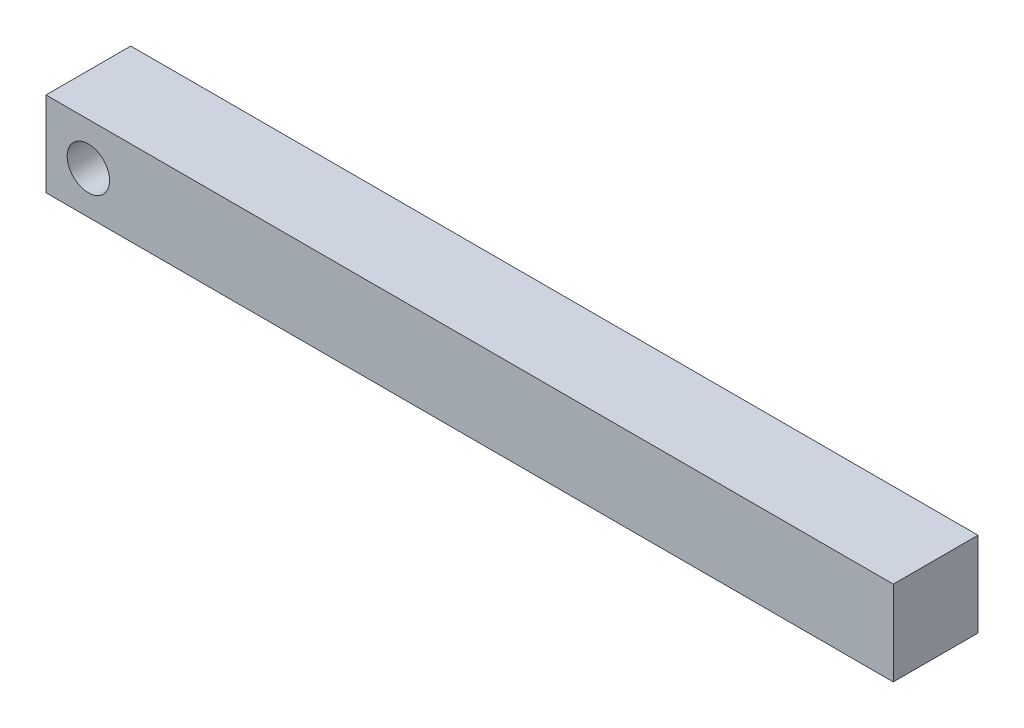
ISO-10303-21;
HEADER;
FILE_DESCRIPTION(('STEP AP214'),'2;1');
FILE_NAME('part.step','',(''),(''),'','','');
FILE_SCHEMA(('AUTOMOTIVE_DESIGN { 1 0 10303 214 1 1 1 1 }'));
ENDSEC;
DATA;
#1=APPLICATION_CONTEXT('core data for automotive mechanical design processes');
#2=APPLICATION_PROTOCOL_DEFINITION('international standard','automotive_design',2000,#1);
#3=PRODUCT_CONTEXT('',#1,'mechanical');
#4=PRODUCT('Part','Part','',(#3));
#5=PRODUCT_RELATED_PRODUCT_CATEGORY('part','',(#4));
#6=PRODUCT_DEFINITION_FORMATION('','',#4);
#7=PRODUCT_DEFINITION_CONTEXT('part definition',#1,'design');
#8=PRODUCT_DEFINITION('design','',#6,#7);
#9=PRODUCT_DEFINITION_SHAPE('','',#8);
#10=(LENGTH_UNIT() NAMED_UNIT(*) SI_UNIT(.MILLI.,.METRE.));
#11=(NAMED_UNIT(*) PLANE_ANGLE_UNIT() SI_UNIT($,.RADIAN.));
#12=(NAMED_UNIT(*) SI_UNIT($,.STERADIAN.) SOLID_ANGLE_UNIT());
#13=UNCERTAINTY_MEASURE_WITH_UNIT(LENGTH_MEASURE(1.E-05),#10,'distance_accuracy_value','');
#14=(GEOMETRIC_REPRESENTATION_CONTEXT(3) GLOBAL_UNCERTAINTY_ASSIGNED_CONTEXT((#13)) GLOBAL_UNIT_ASSIGNED_CONTEXT((#10,
#11,#12)) REPRESENTATION_CONTEXT('',''));
#15=CARTESIAN_POINT('',(0.,0.,0.));
#16=DIRECTION('',(0.,0.,1.));
#17=DIRECTION('',(1.,0.,0.));
#18=AXIS2_PLACEMENT_3D('',#15,#16,#17);
#19=CARTESIAN_POINT('',(100.,10.,20.));
#20=DIRECTION('',(-1.,0.,0.));
#21=DIRECTION('',(0.,-1.,0.));
#22=AXIS2_PLACEMENT_3D('',#19,#20,#21);
#23=PLANE('',#22);
#24=DIRECTION('',(0.,1.,0.));
#25=VECTOR('',#24,1.);
#26=CARTESIAN_POINT('',(100.,10.,0.));
#27=LINE('',#26,#25);
#28=CARTESIAN_POINT('',(100.,-10.,0.));
#29=VERTEX_POINT('',#28);
#30=CARTESIAN_POINT('',(100.,10.,0.));
#31=VERTEX_POINT('',#30);
#32=EDGE_CURVE('E103',#29,#31,#27,.T.);
#33=ORIENTED_EDGE('',*,*,#32,.T.);
#34=DIRECTION('',(0.,0.,-1.));
#35=VECTOR('',#34,1.);
#36=CARTESIAN_POINT('',(100.,10.,20.));
#37=LINE('',#36,#35);
#38=CARTESIAN_POINT('',(100.,10.,20.));
#39=VERTEX_POINT('',#38);
#40=EDGE_CURVE('E11',#39,#31,#37,.T.);
#41=ORIENTED_EDGE('',*,*,#40,.F.);
#42=DIRECTION('',(0.,1.,0.));
#43=VECTOR('',#42,1.);
#44=CARTESIAN_POINT('',(100.,10.,20.));
#45=LINE('',#44,#43);
#46=CARTESIAN_POINT('',(100.,-10.,20.));
#47=VERTEX_POINT('',#46);
#48=EDGE_CURVE('E91',#47,#39,#45,.T.);
#49=ORIENTED_EDGE('',*,*,#48,.F.);
#50=DIRECTION('',(0.,0.,-1.));
#51=VECTOR('',#50,1.);
#52=CARTESIAN_POINT('',(100.,-10.,20.));
#53=LINE('',#52,#51);
#54=EDGE_CURVE('E99',#47,#29,#53,.T.);
#55=ORIENTED_EDGE('',*,*,#54,.T.);
#56=EDGE_LOOP('',(#33,#41,#49,#55));
#57=FACE_BOUND('',#56,.T.);
#58=ADVANCED_FACE('F40',(#57),#23,.F.);
#59=CARTESIAN_POINT('',(-100.,10.,20.));
#60=DIRECTION('',(0.,-1.,0.));
#61=DIRECTION('',(0.,0.,-1.));
#62=AXIS2_PLACEMENT_3D('',#59,#60,#61);
#63=PLANE('',#62);
#64=DIRECTION('',(-1.,0.,0.));
#65=VECTOR('',#64,1.);
#66=CARTESIAN_POINT('',(-100.,10.,0.));
#67=LINE('',#66,#65);
#68=CARTESIAN_POINT('',(-100.,10.,0.));
#69=VERTEX_POINT('',#68);
#70=EDGE_CURVE('E95',#31,#69,#67,.T.);
#71=ORIENTED_EDGE('',*,*,#70,.T.);
#72=DIRECTION('',(0.,0.,-1.));
#73=VECTOR('',#72,1.);
#74=CARTESIAN_POINT('',(-100.,10.,20.));
#75=LINE('',#74,#73);
#76=CARTESIAN_POINT('',(-100.,10.,20.));
#77=VERTEX_POINT('',#76);
#78=EDGE_CURVE('E48',#77,#69,#75,.T.);
#79=ORIENTED_EDGE('',*,*,#78,.F.);
#80=DIRECTION('',(-1.,0.,0.));
#81=VECTOR('',#80,1.);
#82=CARTESIAN_POINT('',(-100.,10.,20.));
#83=LINE('',#82,#81);
#84=EDGE_CURVE('E86',#39,#77,#83,.T.);
#85=ORIENTED_EDGE('',*,*,#84,.F.);
#86=ORIENTED_EDGE('',*,*,#40,.T.);
#87=EDGE_LOOP('',(#71,#79,#85,#86));
#88=FACE_BOUND('',#87,.T.);
#89=ADVANCED_FACE('F94',(#88),#63,.F.);
#90=CARTESIAN_POINT('',(-100.,10.,20.));
#91=DIRECTION('',(1.,0.,0.));
#92=DIRECTION('',(0.,0.,-1.));
#93=AXIS2_PLACEMENT_3D('',#90,#91,#92);
#94=PLANE('',#93);
#95=DIRECTION('',(0.,-1.,0.));
#96=VECTOR('',#95,1.);
#97=CARTESIAN_POINT('',(-100.,10.,0.));
#98=LINE('',#97,#96);
#99=CARTESIAN_POINT('',(-100.,-10.,0.));
#100=VERTEX_POINT('',#99);
#101=EDGE_CURVE('E73',#69,#100,#98,.T.);
#102=ORIENTED_EDGE('',*,*,#101,.T.);
#103=DIRECTION('',(0.,0.,-1.));
#104=VECTOR('',#103,1.);
#105=CARTESIAN_POINT('',(-100.,-10.,20.));
#106=LINE('',#105,#104);
#107=CARTESIAN_POINT('',(-100.,-10.,20.));
#108=VERTEX_POINT('',#107);
#109=EDGE_CURVE('E96',#108,#100,#106,.T.);
#110=ORIENTED_EDGE('',*,*,#109,.F.);
#111=DIRECTION('',(0.,-1.,0.));
#112=VECTOR('',#111,1.);
#113=CARTESIAN_POINT('',(-100.,10.,20.));
#114=LINE('',#113,#112);
#115=EDGE_CURVE('E89',#77,#108,#114,.T.);
#116=ORIENTED_EDGE('',*,*,#115,.F.);
#117=ORIENTED_EDGE('',*,*,#78,.T.);
#118=EDGE_LOOP('',(#102,#110,#116,#117));
#119=FACE_BOUND('',#118,.T.);
#120=ADVANCED_FACE('F97',(#119),#94,.F.);
#121=CARTESIAN_POINT('',(-100.,-10.,20.));
#122=DIRECTION('',(0.,1.,0.));
#123=DIRECTION('',(0.,0.,1.));
#124=AXIS2_PLACEMENT_3D('',#121,#122,#123);
#125=PLANE('',#124);
#126=DIRECTION('',(1.,0.,0.));
#127=VECTOR('',#126,1.);
#128=CARTESIAN_POINT('',(-100.,-10.,0.));
#129=LINE('',#128,#127);
#130=EDGE_CURVE('E79',#100,#29,#129,.T.);
#131=ORIENTED_EDGE('',*,*,#130,.T.);
#132=ORIENTED_EDGE('',*,*,#54,.F.);
#133=DIRECTION('',(1.,0.,0.));
#134=VECTOR('',#133,1.);
#135=CARTESIAN_POINT('',(-100.,-10.,20.));
#136=LINE('',#135,#134);
#137=EDGE_CURVE('E56',#108,#47,#136,.T.);
#138=ORIENTED_EDGE('',*,*,#137,.F.);
#139=ORIENTED_EDGE('',*,*,#109,.T.);
#140=EDGE_LOOP('',(#131,#132,#138,#139));
#141=FACE_BOUND('',#140,.T.);
#142=ADVANCED_FACE('F111',(#141),#125,.F.);
#143=CARTESIAN_POINT('',(0.,0.,20.));
#144=DIRECTION('',(0.,0.,1.));
#145=DIRECTION('',(1.,0.,0.));
#146=AXIS2_PLACEMENT_3D('',#143,#144,#145);
#147=PLANE('',#146);
#148=CARTESIAN_POINT('',(-90.,0.,20.));
#149=DIRECTION('',(0.,0.,1.));
#150=DIRECTION('',(1.,0.,0.));
#151=AXIS2_PLACEMENT_3D('',#148,#149,#150);
#152=CIRCLE('',#151,5.);
#153=CARTESIAN_POINT('',(-85.,0.,20.));
#154=VERTEX_POINT('',#153);
#155=EDGE_CURVE('E117',#154,#154,#152,.T.);
#156=ORIENTED_EDGE('',*,*,#155,.F.);
#157=EDGE_LOOP('',(#156));
#158=FACE_BOUND('',#157,.T.);
#159=ORIENTED_EDGE('',*,*,#48,.T.);
#160=ORIENTED_EDGE('',*,*,#84,.T.);
#161=ORIENTED_EDGE('',*,*,#115,.T.);
#162=ORIENTED_EDGE('',*,*,#137,.T.);
#163=EDGE_LOOP('',(#159,#160,#161,#162));
#164=FACE_BOUND('',#163,.T.);
#165=ADVANCED_FACE('F87',(#158,#164),#147,.T.);
#166=CARTESIAN_POINT('',(0.,0.,0.));
#167=DIRECTION('',(0.,0.,1.));
#168=DIRECTION('',(1.,0.,0.));
#169=AXIS2_PLACEMENT_3D('',#166,#167,#168);
#170=PLANE('',#169);
#171=CARTESIAN_POINT('',(-90.,0.,0.));
#172=DIRECTION('',(0.,0.,1.));
#173=DIRECTION('',(1.,0.,0.));
#174=AXIS2_PLACEMENT_3D('',#171,#172,#173);
#175=CIRCLE('',#174,5.);
#176=CARTESIAN_POINT('',(-85.,0.,0.));
#177=VERTEX_POINT('',#176);
#178=EDGE_CURVE('E106',#177,#177,#175,.T.);
#179=ORIENTED_EDGE('',*,*,#178,.T.);
#180=EDGE_LOOP('',(#179));
#181=FACE_BOUND('',#180,.T.);
#182=ORIENTED_EDGE('',*,*,#32,.F.);
#183=ORIENTED_EDGE('',*,*,#130,.F.);
#184=ORIENTED_EDGE('',*,*,#101,.F.);
#185=ORIENTED_EDGE('',*,*,#70,.F.);
#186=EDGE_LOOP('',(#182,#183,#184,#185));
#187=FACE_BOUND('',#186,.T.);
#188=ADVANCED_FACE('F114',(#181,#187),#170,.F.);
#189=CARTESIAN_POINT('',(-90.,0.,0.));
#190=DIRECTION('',(0.,0.,1.));
#191=DIRECTION('',(1.,0.,0.));
#192=AXIS2_PLACEMENT_3D('',#189,#190,#191);
#193=CYLINDRICAL_SURFACE('',#192,5.);
#194=ORIENTED_EDGE('',*,*,#178,.F.);
#195=EDGE_LOOP('',(#194));
#196=FACE_BOUND('',#195,.T.);
#197=ORIENTED_EDGE('',*,*,#155,.T.);
#198=EDGE_LOOP('',(#197));
#199=FACE_BOUND('',#198,.T.);
#200=ADVANCED_FACE('F124',(#196,#199),#193,.F.);
#201=CLOSED_SHELL('',(#58,#89,#120,#142,#165,#188,#200));
#202=MANIFOLD_SOLID_BREP('B2',#201);
#203=ADVANCED_BREP_SHAPE_REPRESENTATION('',(#18,#202),#14);
#204=SHAPE_DEFINITION_REPRESENTATION(#9,#203);
ENDSEC;
END-ISO-10303-21;
